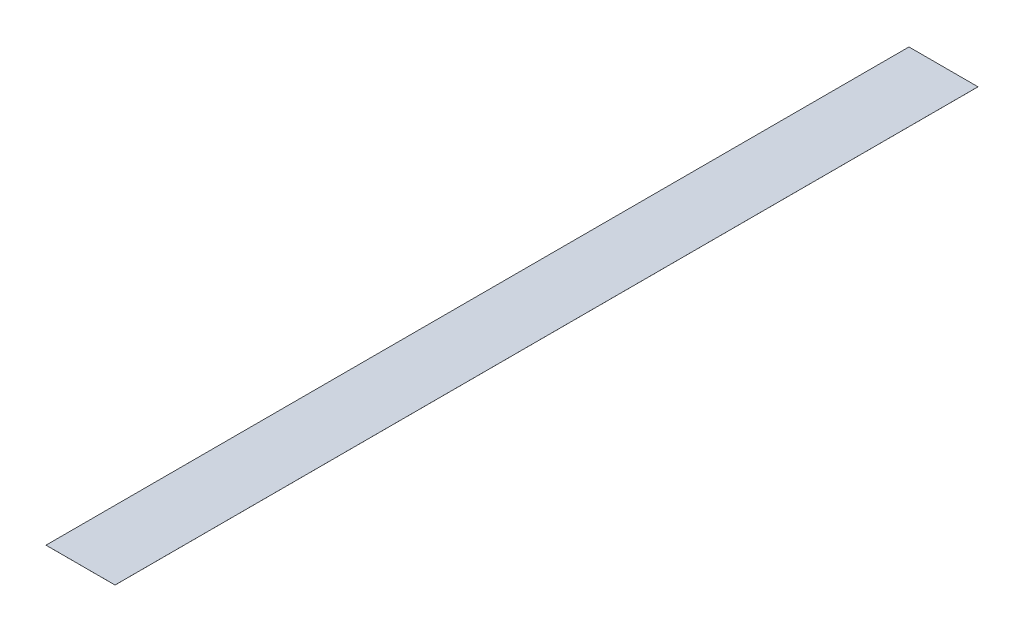
ISO-10303-21;
HEADER;
FILE_DESCRIPTION(('STEP AP214'),'2;1');
FILE_NAME('part.step','',(''),(''),'','','');
FILE_SCHEMA(('AUTOMOTIVE_DESIGN { 1 0 10303 214 1 1 1 1 }'));
ENDSEC;
DATA;
#1=APPLICATION_CONTEXT('core data for automotive mechanical design processes');
#2=APPLICATION_PROTOCOL_DEFINITION('international standard','automotive_design',2000,#1);
#3=PRODUCT_CONTEXT('',#1,'mechanical');
#4=PRODUCT('Part','Part','',(#3));
#5=PRODUCT_RELATED_PRODUCT_CATEGORY('part','',(#4));
#6=PRODUCT_DEFINITION_FORMATION('','',#4);
#7=PRODUCT_DEFINITION_CONTEXT('part definition',#1,'design');
#8=PRODUCT_DEFINITION('design','',#6,#7);
#9=PRODUCT_DEFINITION_SHAPE('','',#8);
#10=(LENGTH_UNIT() NAMED_UNIT(*) SI_UNIT(.MILLI.,.METRE.));
#11=(NAMED_UNIT(*) PLANE_ANGLE_UNIT() SI_UNIT($,.RADIAN.));
#12=(NAMED_UNIT(*) SI_UNIT($,.STERADIAN.) SOLID_ANGLE_UNIT());
#13=UNCERTAINTY_MEASURE_WITH_UNIT(LENGTH_MEASURE(1.E-05),#10,'distance_accuracy_value','');
#14=(GEOMETRIC_REPRESENTATION_CONTEXT(3) GLOBAL_UNCERTAINTY_ASSIGNED_CONTEXT((#13)) GLOBAL_UNIT_ASSIGNED_CONTEXT((#10,
#11,#12)) REPRESENTATION_CONTEXT('',''));
#15=CARTESIAN_POINT('',(0.,0.,0.));
#16=DIRECTION('',(0.,0.,1.));
#17=DIRECTION('',(1.,0.,0.));
#18=AXIS2_PLACEMENT_3D('',#15,#16,#17);
#19=CARTESIAN_POINT('',(-1691.60769633812,0.01,-639.365268114682));
#20=DIRECTION('',(0.,0.,-1.));
#21=DIRECTION('',(-1.,0.,0.));
#22=AXIS2_PLACEMENT_3D('',#19,#20,#21);
#23=PLANE('',#22);
#24=DIRECTION('',(1.,0.,0.));
#25=VECTOR('',#24,1.);
#26=CARTESIAN_POINT('',(-1691.60769633812,0.,-639.365268114682));
#27=LINE('',#26,#25);
#28=CARTESIAN_POINT('',(-1691.60769633812,0.,-639.365268114682));
#29=VERTEX_POINT('',#28);
#30=CARTESIAN_POINT('',(-1671.60769633812,0.,-639.365268114682));
#31=VERTEX_POINT('',#30);
#32=EDGE_CURVE('E107',#29,#31,#27,.T.);
#33=ORIENTED_EDGE('',*,*,#32,.T.);
#34=DIRECTION('',(0.,-1.,0.));
#35=VECTOR('',#34,1.);
#36=CARTESIAN_POINT('',(-1671.60769633812,0.01,-639.365268114682));
#37=LINE('',#36,#35);
#38=CARTESIAN_POINT('',(-1671.60769633812,0.01,-639.365268114682));
#39=VERTEX_POINT('',#38);
#40=EDGE_CURVE('E11',#39,#31,#37,.T.);
#41=ORIENTED_EDGE('',*,*,#40,.F.);
#42=DIRECTION('',(1.,0.,0.));
#43=VECTOR('',#42,1.);
#44=CARTESIAN_POINT('',(-1691.60769633812,0.01,-639.365268114682));
#45=LINE('',#44,#43);
#46=CARTESIAN_POINT('',(-1691.60769633812,0.01,-639.365268114682));
#47=VERTEX_POINT('',#46);
#48=EDGE_CURVE('E89',#47,#39,#45,.T.);
#49=ORIENTED_EDGE('',*,*,#48,.F.);
#50=DIRECTION('',(0.,-1.,0.));
#51=VECTOR('',#50,1.);
#52=CARTESIAN_POINT('',(-1691.60769633812,0.01,-639.365268114682));
#53=LINE('',#52,#51);
#54=EDGE_CURVE('E56',#47,#29,#53,.T.);
#55=ORIENTED_EDGE('',*,*,#54,.T.);
#56=EDGE_LOOP('',(#33,#41,#49,#55));
#57=FACE_BOUND('',#56,.T.);
#58=ADVANCED_FACE('F39',(#57),#23,.F.);
#59=CARTESIAN_POINT('',(-1671.60769633812,0.01,-639.365268114682));
#60=DIRECTION('',(-1.,0.,0.));
#61=DIRECTION('',(0.,0.,1.));
#62=AXIS2_PLACEMENT_3D('',#59,#60,#61);
#63=PLANE('',#62);
#64=DIRECTION('',(0.,0.,-1.));
#65=VECTOR('',#64,1.);
#66=CARTESIAN_POINT('',(-1671.60769633812,0.,-639.365268114682));
#67=LINE('',#66,#65);
#68=CARTESIAN_POINT('',(-1671.60769633812,0.,-889.365268114682));
#69=VERTEX_POINT('',#68);
#70=EDGE_CURVE('E95',#31,#69,#67,.T.);
#71=ORIENTED_EDGE('',*,*,#70,.T.);
#72=DIRECTION('',(0.,-1.,0.));
#73=VECTOR('',#72,1.);
#74=CARTESIAN_POINT('',(-1671.60769633812,0.01,-889.365268114682));
#75=LINE('',#74,#73);
#76=CARTESIAN_POINT('',(-1671.60769633812,0.01,-889.365268114682));
#77=VERTEX_POINT('',#76);
#78=EDGE_CURVE('E48',#77,#69,#75,.T.);
#79=ORIENTED_EDGE('',*,*,#78,.F.);
#80=DIRECTION('',(0.,0.,-1.));
#81=VECTOR('',#80,1.);
#82=CARTESIAN_POINT('',(-1671.60769633812,0.01,-639.365268114682));
#83=LINE('',#82,#81);
#84=EDGE_CURVE('E81',#39,#77,#83,.T.);
#85=ORIENTED_EDGE('',*,*,#84,.F.);
#86=ORIENTED_EDGE('',*,*,#40,.T.);
#87=EDGE_LOOP('',(#71,#79,#85,#86));
#88=FACE_BOUND('',#87,.T.);
#89=ADVANCED_FACE('F94',(#88),#63,.F.);
#90=CARTESIAN_POINT('',(-1691.60769633812,0.01,-889.365268114682));
#91=DIRECTION('',(0.,0.,-1.));
#92=DIRECTION('',(-1.,0.,0.));
#93=AXIS2_PLACEMENT_3D('',#90,#91,#92);
#94=PLANE('',#93);
#95=DIRECTION('',(1.,0.,0.));
#96=VECTOR('',#95,1.);
#97=CARTESIAN_POINT('',(-1691.60769633812,0.,-889.365268114682));
#98=LINE('',#97,#96);
#99=CARTESIAN_POINT('',(-1691.60769633812,0.,-889.365268114682));
#100=VERTEX_POINT('',#99);
#101=EDGE_CURVE('E112',#100,#69,#98,.T.);
#102=ORIENTED_EDGE('',*,*,#101,.F.);
#103=DIRECTION('',(0.,-1.,0.));
#104=VECTOR('',#103,1.);
#105=CARTESIAN_POINT('',(-1691.60769633812,0.01,-889.365268114682));
#106=LINE('',#105,#104);
#107=CARTESIAN_POINT('',(-1691.60769633812,0.01,-889.365268114682));
#108=VERTEX_POINT('',#107);
#109=EDGE_CURVE('E70',#108,#100,#106,.T.);
#110=ORIENTED_EDGE('',*,*,#109,.F.);
#111=DIRECTION('',(1.,0.,0.));
#112=VECTOR('',#111,1.);
#113=CARTESIAN_POINT('',(-1691.60769633812,0.01,-889.365268114682));
#114=LINE('',#113,#112);
#115=EDGE_CURVE('E88',#108,#77,#114,.T.);
#116=ORIENTED_EDGE('',*,*,#115,.T.);
#117=ORIENTED_EDGE('',*,*,#78,.T.);
#118=EDGE_LOOP('',(#102,#110,#116,#117));
#119=FACE_BOUND('',#118,.T.);
#120=ADVANCED_FACE('F99',(#119),#94,.T.);
#121=CARTESIAN_POINT('',(-1691.60769633812,0.01,-639.365268114682));
#122=DIRECTION('',(-1.,0.,0.));
#123=DIRECTION('',(0.,0.,1.));
#124=AXIS2_PLACEMENT_3D('',#121,#122,#123);
#125=PLANE('',#124);
#126=DIRECTION('',(0.,0.,-1.));
#127=VECTOR('',#126,1.);
#128=CARTESIAN_POINT('',(-1691.60769633812,0.,-639.365268114682));
#129=LINE('',#128,#127);
#130=EDGE_CURVE('E115',#29,#100,#129,.T.);
#131=ORIENTED_EDGE('',*,*,#130,.F.);
#132=ORIENTED_EDGE('',*,*,#54,.F.);
#133=DIRECTION('',(0.,0.,-1.));
#134=VECTOR('',#133,1.);
#135=CARTESIAN_POINT('',(-1691.60769633812,0.01,-639.365268114682));
#136=LINE('',#135,#134);
#137=EDGE_CURVE('E101',#47,#108,#136,.T.);
#138=ORIENTED_EDGE('',*,*,#137,.T.);
#139=ORIENTED_EDGE('',*,*,#109,.T.);
#140=EDGE_LOOP('',(#131,#132,#138,#139));
#141=FACE_BOUND('',#140,.T.);
#142=ADVANCED_FACE('F125',(#141),#125,.T.);
#143=CARTESIAN_POINT('',(0.,0.01,0.));
#144=DIRECTION('',(0.,1.,0.));
#145=DIRECTION('',(0.,0.,1.));
#146=AXIS2_PLACEMENT_3D('',#143,#144,#145);
#147=PLANE('',#146);
#148=ORIENTED_EDGE('',*,*,#48,.T.);
#149=ORIENTED_EDGE('',*,*,#84,.T.);
#150=ORIENTED_EDGE('',*,*,#115,.F.);
#151=ORIENTED_EDGE('',*,*,#137,.F.);
#152=EDGE_LOOP('',(#148,#149,#150,#151));
#153=FACE_BOUND('',#152,.T.);
#154=ADVANCED_FACE('F85',(#153),#147,.T.);
#155=CARTESIAN_POINT('',(0.,0.,0.));
#156=DIRECTION('',(0.,1.,0.));
#157=DIRECTION('',(0.,0.,1.));
#158=AXIS2_PLACEMENT_3D('',#155,#156,#157);
#159=PLANE('',#158);
#160=ORIENTED_EDGE('',*,*,#32,.F.);
#161=ORIENTED_EDGE('',*,*,#130,.T.);
#162=ORIENTED_EDGE('',*,*,#101,.T.);
#163=ORIENTED_EDGE('',*,*,#70,.F.);
#164=EDGE_LOOP('',(#160,#161,#162,#163));
#165=FACE_BOUND('',#164,.T.);
#166=ADVANCED_FACE('F124',(#165),#159,.F.);
#167=CLOSED_SHELL('',(#58,#89,#120,#142,#154,#166));
#168=MANIFOLD_SOLID_BREP('B2',#167);
#169=ADVANCED_BREP_SHAPE_REPRESENTATION('',(#18,#168),#14);
#170=SHAPE_DEFINITION_REPRESENTATION(#9,#169);
ENDSEC;
END-ISO-10303-21;
